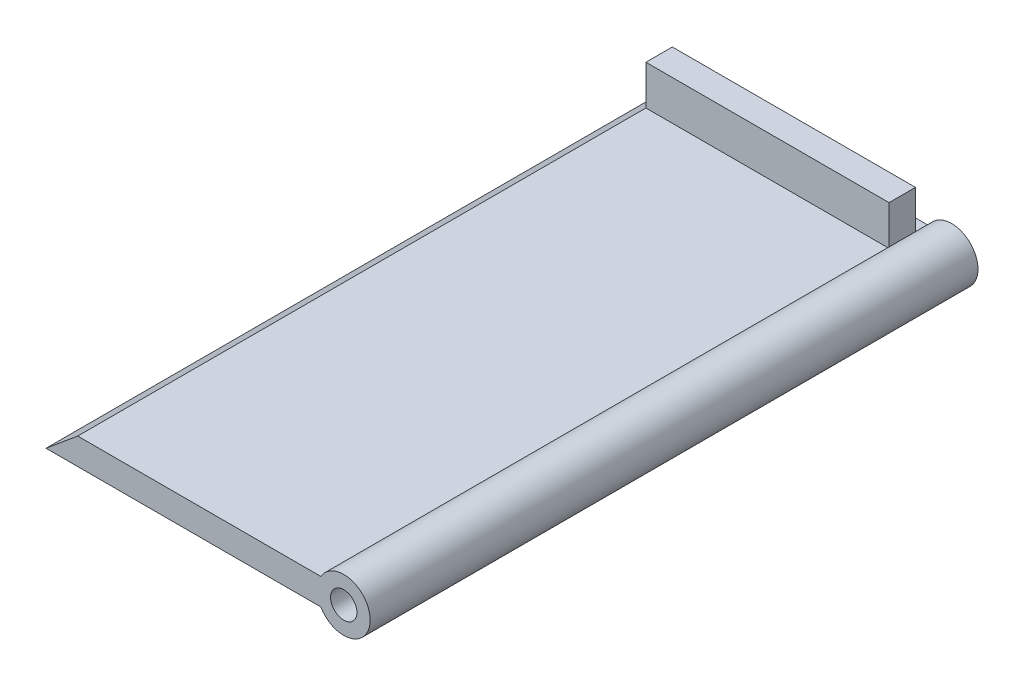
ISO-10303-21;
HEADER;
FILE_DESCRIPTION(('STEP AP214'),'2;1');
FILE_NAME('part.step','',(''),(''),'','','');
FILE_SCHEMA(('AUTOMOTIVE_DESIGN { 1 0 10303 214 1 1 1 1 }'));
ENDSEC;
DATA;
#1=APPLICATION_CONTEXT('core data for automotive mechanical design processes');
#2=APPLICATION_PROTOCOL_DEFINITION('international standard','automotive_design',2000,#1);
#3=PRODUCT_CONTEXT('',#1,'mechanical');
#4=PRODUCT('Part','Part','',(#3));
#5=PRODUCT_RELATED_PRODUCT_CATEGORY('part','',(#4));
#6=PRODUCT_DEFINITION_FORMATION('','',#4);
#7=PRODUCT_DEFINITION_CONTEXT('part definition',#1,'design');
#8=PRODUCT_DEFINITION('design','',#6,#7);
#9=PRODUCT_DEFINITION_SHAPE('','',#8);
#10=(LENGTH_UNIT() NAMED_UNIT(*) SI_UNIT(.MILLI.,.METRE.));
#11=(NAMED_UNIT(*) PLANE_ANGLE_UNIT() SI_UNIT($,.RADIAN.));
#12=(NAMED_UNIT(*) SI_UNIT($,.STERADIAN.) SOLID_ANGLE_UNIT());
#13=UNCERTAINTY_MEASURE_WITH_UNIT(LENGTH_MEASURE(1.E-05),#10,'distance_accuracy_value','');
#14=(GEOMETRIC_REPRESENTATION_CONTEXT(3) GLOBAL_UNCERTAINTY_ASSIGNED_CONTEXT((#13)) GLOBAL_UNIT_ASSIGNED_CONTEXT((#10,
#11,#12)) REPRESENTATION_CONTEXT('',''));
#15=CARTESIAN_POINT('',(0.,0.,0.));
#16=DIRECTION('',(0.,0.,1.));
#17=DIRECTION('',(1.,0.,0.));
#18=AXIS2_PLACEMENT_3D('',#15,#16,#17);
#19=CARTESIAN_POINT('',(32.7967450455694,2.81520392924816,146.05));
#20=DIRECTION('',(0.,-1.,0.));
#21=DIRECTION('',(1.,0.,0.));
#22=AXIS2_PLACEMENT_3D('',#19,#20,#21);
#23=PLANE('',#22);
#24=DIRECTION('',(-1.,0.,0.));
#25=VECTOR('',#24,1.);
#26=CARTESIAN_POINT('',(32.7967450455694,2.81520392924816,0.));
#27=LINE('',#26,#25);
#28=CARTESIAN_POINT('',(32.7967450455694,2.81520392924816,0.));
#29=VERTEX_POINT('',#28);
#30=CARTESIAN_POINT('',(-25.6232549544306,2.81520392924816,0.));
#31=VERTEX_POINT('',#30);
#32=EDGE_CURVE('E140',#29,#31,#27,.T.);
#33=ORIENTED_EDGE('',*,*,#32,.T.);
#34=DIRECTION('',(0.,0.,1.));
#35=VECTOR('',#34,1.);
#36=CARTESIAN_POINT('',(-25.6232549544306,2.81520392924816,0.));
#37=LINE('',#36,#35);
#38=CARTESIAN_POINT('',(-25.6232549544306,2.81520392924816,3.175));
#39=VERTEX_POINT('',#38);
#40=EDGE_CURVE('E123',#31,#39,#37,.T.);
#41=ORIENTED_EDGE('',*,*,#40,.T.);
#42=DIRECTION('',(1.,0.,0.));
#43=VECTOR('',#42,1.);
#44=CARTESIAN_POINT('',(-22.4482549544306,2.81520392924816,3.175));
#45=LINE('',#44,#43);
#46=CARTESIAN_POINT('',(-22.4482549544306,2.81520392924816,3.17500000000001));
#47=VERTEX_POINT('',#46);
#48=EDGE_CURVE('E200',#39,#47,#45,.T.);
#49=ORIENTED_EDGE('',*,*,#48,.T.);
#50=DIRECTION('',(0.,0.,-1.));
#51=VECTOR('',#50,1.);
#52=CARTESIAN_POINT('',(-22.4482549544306,2.81520392924816,6.35));
#53=LINE('',#52,#51);
#54=CARTESIAN_POINT('',(-22.4482549544306,2.81520392924816,6.34999999999999));
#55=VERTEX_POINT('',#54);
#56=EDGE_CURVE('E55',#55,#47,#53,.T.);
#57=ORIENTED_EDGE('',*,*,#56,.F.);
#58=DIRECTION('',(1.,0.,0.));
#59=VECTOR('',#58,1.);
#60=CARTESIAN_POINT('',(-25.6232549544306,2.81520392924816,6.35));
#61=LINE('',#60,#59);
#62=CARTESIAN_POINT('',(29.6217450455693,2.81520392924816,6.35));
#63=VERTEX_POINT('',#62);
#64=EDGE_CURVE('E217',#55,#63,#61,.T.);
#65=ORIENTED_EDGE('',*,*,#64,.T.);
#66=DIRECTION('',(0.,0.,-1.));
#67=VECTOR('',#66,1.);
#68=CARTESIAN_POINT('',(29.6217450455693,2.81520392924816,6.35));
#69=LINE('',#68,#67);
#70=CARTESIAN_POINT('',(29.6217450455693,2.81520392924816,3.175));
#71=VERTEX_POINT('',#70);
#72=EDGE_CURVE('E186',#63,#71,#69,.T.);
#73=ORIENTED_EDGE('',*,*,#72,.T.);
#74=DIRECTION('',(1.,0.,0.));
#75=VECTOR('',#74,1.);
#76=CARTESIAN_POINT('',(32.7967450455694,2.81520392924816,3.175));
#77=LINE('',#76,#75);
#78=CARTESIAN_POINT('',(32.7967450455694,2.81520392924816,3.17500000000001));
#79=VERTEX_POINT('',#78);
#80=EDGE_CURVE('E190',#71,#79,#77,.T.);
#81=ORIENTED_EDGE('',*,*,#80,.T.);
#82=DIRECTION('',(0.,0.,-1.));
#83=VECTOR('',#82,1.);
#84=CARTESIAN_POINT('',(32.7967450455694,2.81520392924816,146.05));
#85=LINE('',#84,#83);
#86=EDGE_CURVE('E41',#79,#29,#85,.T.);
#87=ORIENTED_EDGE('',*,*,#86,.T.);
#88=EDGE_LOOP('',(#33,#41,#49,#57,#65,#73,#81,#87));
#89=FACE_BOUND('',#88,.T.);
#90=ADVANCED_FACE('F33',(#89),#23,.F.);
#91=DIRECTION('',(1.,0.,0.));
#92=VECTOR('',#91,1.);
#93=CARTESIAN_POINT('',(-25.6232549544306,2.81520392924816,9.525));
#94=LINE('',#93,#92);
#95=CARTESIAN_POINT('',(-25.6232549544306,2.81520392924816,9.52500000000001));
#96=VERTEX_POINT('',#95);
#97=CARTESIAN_POINT('',(32.7967450455694,2.81520392924816,9.52500000000001));
#98=VERTEX_POINT('',#97);
#99=EDGE_CURVE('E225',#96,#98,#94,.T.);
#100=ORIENTED_EDGE('',*,*,#99,.F.);
#101=CARTESIAN_POINT('',(-25.6232549544306,2.81520392924816,146.05));
#102=VERTEX_POINT('',#101);
#103=EDGE_CURVE('E133',#96,#102,#37,.T.);
#104=ORIENTED_EDGE('',*,*,#103,.T.);
#105=DIRECTION('',(-1.,0.,0.));
#106=VECTOR('',#105,1.);
#107=CARTESIAN_POINT('',(32.7967450455694,2.81520392924816,146.05));
#108=LINE('',#107,#106);
#109=CARTESIAN_POINT('',(32.7967450455694,2.81520392924816,146.05));
#110=VERTEX_POINT('',#109);
#111=EDGE_CURVE('E158',#110,#102,#108,.T.);
#112=ORIENTED_EDGE('',*,*,#111,.F.);
#113=EDGE_CURVE('E11',#110,#98,#85,.T.);
#114=ORIENTED_EDGE('',*,*,#113,.T.);
#115=EDGE_LOOP('',(#100,#104,#112,#114));
#116=FACE_BOUND('',#115,.T.);
#117=ADVANCED_FACE('F234',(#116),#23,.F.);
#118=CARTESIAN_POINT('',(38.2960063596005,-0.359796070751835,146.05));
#119=DIRECTION('',(0.,0.,1.));
#120=DIRECTION('',(1.,0.,0.));
#121=AXIS2_PLACEMENT_3D('',#118,#119,#120);
#122=PLANE('',#121);
#123=DIRECTION('',(0.768221279597376,0.64018439966448,0.));
#124=VECTOR('',#123,1.);
#125=CARTESIAN_POINT('',(-33.2432549544307,-3.53479607075184,146.05));
#126=LINE('',#125,#124);
#127=CARTESIAN_POINT('',(-33.2432549544307,-3.53479607075184,146.05));
#128=VERTEX_POINT('',#127);
#129=EDGE_CURVE('E144',#128,#102,#126,.T.);
#130=ORIENTED_EDGE('',*,*,#129,.F.);
#131=DIRECTION('',(1.,0.,0.));
#132=VECTOR('',#131,1.);
#133=CARTESIAN_POINT('',(32.7967450455694,-3.53479607075183,146.05));
#134=LINE('',#133,#132);
#135=CARTESIAN_POINT('',(32.7967450455694,-3.53479607075183,146.05));
#136=VERTEX_POINT('',#135);
#137=EDGE_CURVE('E155',#128,#136,#134,.T.);
#138=ORIENTED_EDGE('',*,*,#137,.T.);
#139=CARTESIAN_POINT('',(38.2960063596005,-0.359796070751835,146.05));
#140=DIRECTION('',(0.,0.,1.));
#141=DIRECTION('',(1.,0.,0.));
#142=AXIS2_PLACEMENT_3D('',#139,#140,#141);
#143=CIRCLE('',#142,6.35);
#144=EDGE_CURVE('E148',#136,#110,#143,.T.);
#145=ORIENTED_EDGE('',*,*,#144,.T.);
#146=ORIENTED_EDGE('',*,*,#111,.T.);
#147=EDGE_LOOP('',(#130,#138,#145,#146));
#148=FACE_BOUND('',#147,.T.);
#149=CARTESIAN_POINT('',(38.2960063596005,-0.359796070751835,146.05));
#150=DIRECTION('',(0.,0.,1.));
#151=DIRECTION('',(1.,0.,0.));
#152=AXIS2_PLACEMENT_3D('',#149,#150,#151);
#153=CIRCLE('',#152,3.175);
#154=CARTESIAN_POINT('',(41.4710063596005,-0.359796070751835,146.05));
#155=VERTEX_POINT('',#154);
#156=EDGE_CURVE('E150',#155,#155,#153,.T.);
#157=ORIENTED_EDGE('',*,*,#156,.F.);
#158=EDGE_LOOP('',(#157));
#159=FACE_BOUND('',#158,.T.);
#160=ADVANCED_FACE('F235',(#148,#159),#122,.T.);
#161=CARTESIAN_POINT('',(38.2960063596005,-0.359796070751835,0.));
#162=DIRECTION('',(0.,0.,1.));
#163=DIRECTION('',(1.,0.,0.));
#164=AXIS2_PLACEMENT_3D('',#161,#162,#163);
#165=PLANE('',#164);
#166=DIRECTION('',(1.,0.,0.));
#167=VECTOR('',#166,1.);
#168=CARTESIAN_POINT('',(32.7967450455694,-3.53479607075183,0.));
#169=LINE('',#168,#167);
#170=CARTESIAN_POINT('',(-33.2432549544307,-3.53479607075184,0.));
#171=VERTEX_POINT('',#170);
#172=CARTESIAN_POINT('',(32.7967450455694,-3.53479607075183,0.));
#173=VERTEX_POINT('',#172);
#174=EDGE_CURVE('E142',#171,#173,#169,.T.);
#175=ORIENTED_EDGE('',*,*,#174,.F.);
#176=DIRECTION('',(0.768221279597376,0.64018439966448,0.));
#177=VECTOR('',#176,1.);
#178=CARTESIAN_POINT('',(-33.2432549544307,-3.53479607075184,0.));
#179=LINE('',#178,#177);
#180=EDGE_CURVE('E126',#171,#31,#179,.T.);
#181=ORIENTED_EDGE('',*,*,#180,.T.);
#182=ORIENTED_EDGE('',*,*,#32,.F.);
#183=CARTESIAN_POINT('',(38.2960063596005,-0.359796070751835,0.));
#184=DIRECTION('',(0.,0.,1.));
#185=DIRECTION('',(1.,0.,0.));
#186=AXIS2_PLACEMENT_3D('',#183,#184,#185);
#187=CIRCLE('',#186,6.35);
#188=EDGE_CURVE('E146',#173,#29,#187,.T.);
#189=ORIENTED_EDGE('',*,*,#188,.F.);
#190=EDGE_LOOP('',(#175,#181,#182,#189));
#191=FACE_BOUND('',#190,.T.);
#192=CARTESIAN_POINT('',(38.2960063596005,-0.359796070751835,0.));
#193=DIRECTION('',(0.,0.,1.));
#194=DIRECTION('',(1.,0.,0.));
#195=AXIS2_PLACEMENT_3D('',#192,#193,#194);
#196=CIRCLE('',#195,3.175);
#197=CARTESIAN_POINT('',(41.4710063596005,-0.359796070751835,0.));
#198=VERTEX_POINT('',#197);
#199=EDGE_CURVE('E167',#198,#198,#196,.T.);
#200=ORIENTED_EDGE('',*,*,#199,.T.);
#201=EDGE_LOOP('',(#200));
#202=FACE_BOUND('',#201,.T.);
#203=ADVANCED_FACE('F137',(#191,#202),#165,.F.);
#204=CARTESIAN_POINT('',(38.2960063596005,-0.359796070751835,146.05));
#205=DIRECTION('',(0.,0.,-1.));
#206=DIRECTION('',(-1.,0.,0.));
#207=AXIS2_PLACEMENT_3D('',#204,#205,#206);
#208=CYLINDRICAL_SURFACE('',#207,6.35);
#209=ORIENTED_EDGE('',*,*,#188,.T.);
#210=ORIENTED_EDGE('',*,*,#86,.F.);
#211=DIRECTION('',(0.,0.,-1.));
#212=VECTOR('',#211,1.);
#213=CARTESIAN_POINT('',(32.7967450455694,2.81520392924816,6.35));
#214=LINE('',#213,#212);
#215=EDGE_CURVE('E48',#98,#79,#214,.T.);
#216=ORIENTED_EDGE('',*,*,#215,.F.);
#217=ORIENTED_EDGE('',*,*,#113,.F.);
#218=ORIENTED_EDGE('',*,*,#144,.F.);
#219=DIRECTION('',(0.,0.,-1.));
#220=VECTOR('',#219,1.);
#221=CARTESIAN_POINT('',(32.7967450455694,-3.53479607075183,146.05));
#222=LINE('',#221,#220);
#223=EDGE_CURVE('E153',#136,#173,#222,.T.);
#224=ORIENTED_EDGE('',*,*,#223,.T.);
#225=EDGE_LOOP('',(#209,#210,#216,#217,#218,#224));
#226=FACE_BOUND('',#225,.T.);
#227=ADVANCED_FACE('F35',(#226),#208,.T.);
#228=CARTESIAN_POINT('',(32.7967450455694,-3.53479607075183,146.05));
#229=DIRECTION('',(0.,1.,0.));
#230=DIRECTION('',(-1.,0.,0.));
#231=AXIS2_PLACEMENT_3D('',#228,#229,#230);
#232=PLANE('',#231);
#233=ORIENTED_EDGE('',*,*,#174,.T.);
#234=ORIENTED_EDGE('',*,*,#223,.F.);
#235=ORIENTED_EDGE('',*,*,#137,.F.);
#236=DIRECTION('',(0.,0.,1.));
#237=VECTOR('',#236,1.);
#238=CARTESIAN_POINT('',(-33.2432549544307,-3.53479607075184,0.));
#239=LINE('',#238,#237);
#240=EDGE_CURVE('E132',#171,#128,#239,.T.);
#241=ORIENTED_EDGE('',*,*,#240,.F.);
#242=EDGE_LOOP('',(#233,#234,#235,#241));
#243=FACE_BOUND('',#242,.T.);
#244=ADVANCED_FACE('F281',(#243),#232,.F.);
#245=CARTESIAN_POINT('',(38.2960063596005,-0.359796070751835,146.05));
#246=DIRECTION('',(0.,0.,-1.));
#247=DIRECTION('',(-1.,0.,0.));
#248=AXIS2_PLACEMENT_3D('',#245,#246,#247);
#249=CYLINDRICAL_SURFACE('',#248,3.175);
#250=ORIENTED_EDGE('',*,*,#156,.T.);
#251=EDGE_LOOP('',(#250));
#252=FACE_BOUND('',#251,.T.);
#253=ORIENTED_EDGE('',*,*,#199,.F.);
#254=EDGE_LOOP('',(#253));
#255=FACE_BOUND('',#254,.T.);
#256=ADVANCED_FACE('F284',(#252,#255),#249,.F.);
#257=CARTESIAN_POINT('',(32.7967450455694,2.81520392924816,6.35));
#258=DIRECTION('',(-1.,0.,0.));
#259=DIRECTION('',(0.,0.,1.));
#260=AXIS2_PLACEMENT_3D('',#257,#258,#259);
#261=PLANE('',#260);
#262=DIRECTION('',(0.,1.,0.));
#263=VECTOR('',#262,1.);
#264=CARTESIAN_POINT('',(32.7967450455694,2.81520392924816,3.175));
#265=LINE('',#264,#263);
#266=CARTESIAN_POINT('',(32.7967450455694,12.3402039292482,3.175));
#267=VERTEX_POINT('',#266);
#268=EDGE_CURVE('E206',#79,#267,#265,.T.);
#269=ORIENTED_EDGE('',*,*,#268,.T.);
#270=DIRECTION('',(0.,0.,-1.));
#271=VECTOR('',#270,1.);
#272=CARTESIAN_POINT('',(32.7967450455694,12.3402039292482,6.35));
#273=LINE('',#272,#271);
#274=CARTESIAN_POINT('',(32.7967450455694,12.3402039292482,9.525));
#275=VERTEX_POINT('',#274);
#276=EDGE_CURVE('E170',#275,#267,#273,.T.);
#277=ORIENTED_EDGE('',*,*,#276,.F.);
#278=DIRECTION('',(0.,1.,0.));
#279=VECTOR('',#278,1.);
#280=CARTESIAN_POINT('',(32.7967450455694,12.3402039292482,9.525));
#281=LINE('',#280,#279);
#282=EDGE_CURVE('E222',#98,#275,#281,.T.);
#283=ORIENTED_EDGE('',*,*,#282,.F.);
#284=ORIENTED_EDGE('',*,*,#215,.T.);
#285=EDGE_LOOP('',(#269,#277,#283,#284));
#286=FACE_BOUND('',#285,.T.);
#287=ADVANCED_FACE('F243',(#286),#261,.F.);
#288=CARTESIAN_POINT('',(32.7967450455694,12.3402039292482,6.35));
#289=DIRECTION('',(0.,-1.,0.));
#290=DIRECTION('',(1.,0.,0.));
#291=AXIS2_PLACEMENT_3D('',#288,#289,#290);
#292=PLANE('',#291);
#293=DIRECTION('',(-1.,0.,0.));
#294=VECTOR('',#293,1.);
#295=CARTESIAN_POINT('',(32.7967450455694,12.3402039292482,3.175));
#296=LINE('',#295,#294);
#297=CARTESIAN_POINT('',(-25.6232549544306,12.3402039292482,3.175));
#298=VERTEX_POINT('',#297);
#299=EDGE_CURVE('E204',#267,#298,#296,.T.);
#300=ORIENTED_EDGE('',*,*,#299,.T.);
#301=DIRECTION('',(0.,0.,-1.));
#302=VECTOR('',#301,1.);
#303=CARTESIAN_POINT('',(-25.6232549544306,12.3402039292482,6.35));
#304=LINE('',#303,#302);
#305=CARTESIAN_POINT('',(-25.6232549544306,12.3402039292482,9.525));
#306=VERTEX_POINT('',#305);
#307=EDGE_CURVE('E175',#306,#298,#304,.T.);
#308=ORIENTED_EDGE('',*,*,#307,.F.);
#309=DIRECTION('',(-1.,0.,0.));
#310=VECTOR('',#309,1.);
#311=CARTESIAN_POINT('',(-25.6232549544306,12.3402039292482,9.525));
#312=LINE('',#311,#310);
#313=EDGE_CURVE('E209',#275,#306,#312,.T.);
#314=ORIENTED_EDGE('',*,*,#313,.F.);
#315=ORIENTED_EDGE('',*,*,#276,.T.);
#316=EDGE_LOOP('',(#300,#308,#314,#315));
#317=FACE_BOUND('',#316,.T.);
#318=ADVANCED_FACE('F246',(#317),#292,.F.);
#319=CARTESIAN_POINT('',(-25.6232549544306,2.81520392924816,6.35));
#320=DIRECTION('',(1.,0.,0.));
#321=DIRECTION('',(0.,0.,-1.));
#322=AXIS2_PLACEMENT_3D('',#319,#320,#321);
#323=PLANE('',#322);
#324=DIRECTION('',(0.,-1.,0.));
#325=VECTOR('',#324,1.);
#326=CARTESIAN_POINT('',(-25.6232549544306,2.81520392924816,3.175));
#327=LINE('',#326,#325);
#328=EDGE_CURVE('E202',#298,#39,#327,.T.);
#329=ORIENTED_EDGE('',*,*,#328,.T.);
#330=DIRECTION('',(0.,0.,-1.));
#331=VECTOR('',#330,1.);
#332=CARTESIAN_POINT('',(-25.6232549544306,2.81520392924816,6.35));
#333=LINE('',#332,#331);
#334=EDGE_CURVE('E129',#96,#39,#333,.T.);
#335=ORIENTED_EDGE('',*,*,#334,.F.);
#336=DIRECTION('',(0.,-1.,0.));
#337=VECTOR('',#336,1.);
#338=CARTESIAN_POINT('',(-25.6232549544306,12.3402039292482,9.525));
#339=LINE('',#338,#337);
#340=EDGE_CURVE('E219',#306,#96,#339,.T.);
#341=ORIENTED_EDGE('',*,*,#340,.F.);
#342=ORIENTED_EDGE('',*,*,#307,.T.);
#343=EDGE_LOOP('',(#329,#335,#341,#342));
#344=FACE_BOUND('',#343,.T.);
#345=ADVANCED_FACE('F248',(#344),#323,.F.);
#346=CARTESIAN_POINT('',(-22.4482549544306,2.81520392924816,6.35));
#347=DIRECTION('',(-1.,0.,0.));
#348=DIRECTION('',(0.,0.,1.));
#349=AXIS2_PLACEMENT_3D('',#346,#347,#348);
#350=PLANE('',#349);
#351=DIRECTION('',(0.,1.,0.));
#352=VECTOR('',#351,1.);
#353=CARTESIAN_POINT('',(-22.4482549544306,2.81520392924816,3.175));
#354=LINE('',#353,#352);
#355=CARTESIAN_POINT('',(-22.4482549544306,9.16520392924816,3.175));
#356=VERTEX_POINT('',#355);
#357=EDGE_CURVE('E198',#47,#356,#354,.T.);
#358=ORIENTED_EDGE('',*,*,#357,.T.);
#359=DIRECTION('',(0.,0.,-1.));
#360=VECTOR('',#359,1.);
#361=CARTESIAN_POINT('',(-22.4482549544306,9.16520392924816,6.35));
#362=LINE('',#361,#360);
#363=CARTESIAN_POINT('',(-22.4482549544306,9.16520392924816,6.35));
#364=VERTEX_POINT('',#363);
#365=EDGE_CURVE('E180',#364,#356,#362,.T.);
#366=ORIENTED_EDGE('',*,*,#365,.F.);
#367=DIRECTION('',(0.,1.,0.));
#368=VECTOR('',#367,1.);
#369=CARTESIAN_POINT('',(-22.4482549544306,2.81520392924816,6.35));
#370=LINE('',#369,#368);
#371=EDGE_CURVE('E192',#55,#364,#370,.T.);
#372=ORIENTED_EDGE('',*,*,#371,.F.);
#373=ORIENTED_EDGE('',*,*,#56,.T.);
#374=EDGE_LOOP('',(#358,#366,#372,#373));
#375=FACE_BOUND('',#374,.T.);
#376=ADVANCED_FACE('F256',(#375),#350,.F.);
#377=CARTESIAN_POINT('',(29.6217450455693,9.16520392924816,6.35));
#378=DIRECTION('',(0.,1.,0.));
#379=DIRECTION('',(-1.,0.,0.));
#380=AXIS2_PLACEMENT_3D('',#377,#378,#379);
#381=PLANE('',#380);
#382=DIRECTION('',(1.,0.,0.));
#383=VECTOR('',#382,1.);
#384=CARTESIAN_POINT('',(29.6217450455693,9.16520392924816,3.175));
#385=LINE('',#384,#383);
#386=CARTESIAN_POINT('',(29.6217450455693,9.16520392924816,3.175));
#387=VERTEX_POINT('',#386);
#388=EDGE_CURVE('E196',#356,#387,#385,.T.);
#389=ORIENTED_EDGE('',*,*,#388,.T.);
#390=DIRECTION('',(0.,0.,-1.));
#391=VECTOR('',#390,1.);
#392=CARTESIAN_POINT('',(29.6217450455693,9.16520392924816,6.35));
#393=LINE('',#392,#391);
#394=CARTESIAN_POINT('',(29.6217450455693,9.16520392924816,6.35));
#395=VERTEX_POINT('',#394);
#396=EDGE_CURVE('E183',#395,#387,#393,.T.);
#397=ORIENTED_EDGE('',*,*,#396,.F.);
#398=DIRECTION('',(1.,0.,0.));
#399=VECTOR('',#398,1.);
#400=CARTESIAN_POINT('',(29.6217450455693,9.16520392924816,6.35));
#401=LINE('',#400,#399);
#402=EDGE_CURVE('E212',#364,#395,#401,.T.);
#403=ORIENTED_EDGE('',*,*,#402,.F.);
#404=ORIENTED_EDGE('',*,*,#365,.T.);
#405=EDGE_LOOP('',(#389,#397,#403,#404));
#406=FACE_BOUND('',#405,.T.);
#407=ADVANCED_FACE('F267',(#406),#381,.F.);
#408=CARTESIAN_POINT('',(29.6217450455693,2.81520392924816,6.35));
#409=DIRECTION('',(1.,0.,0.));
#410=DIRECTION('',(0.,0.,-1.));
#411=AXIS2_PLACEMENT_3D('',#408,#409,#410);
#412=PLANE('',#411);
#413=DIRECTION('',(0.,-1.,0.));
#414=VECTOR('',#413,1.);
#415=CARTESIAN_POINT('',(29.6217450455693,2.81520392924816,3.175));
#416=LINE('',#415,#414);
#417=EDGE_CURVE('E193',#387,#71,#416,.T.);
#418=ORIENTED_EDGE('',*,*,#417,.T.);
#419=ORIENTED_EDGE('',*,*,#72,.F.);
#420=DIRECTION('',(0.,-1.,0.));
#421=VECTOR('',#420,1.);
#422=CARTESIAN_POINT('',(29.6217450455693,2.81520392924816,6.35));
#423=LINE('',#422,#421);
#424=EDGE_CURVE('E189',#395,#63,#423,.T.);
#425=ORIENTED_EDGE('',*,*,#424,.F.);
#426=ORIENTED_EDGE('',*,*,#396,.T.);
#427=EDGE_LOOP('',(#418,#419,#425,#426));
#428=FACE_BOUND('',#427,.T.);
#429=ADVANCED_FACE('F265',(#428),#412,.F.);
#430=CARTESIAN_POINT('',(0.,0.,3.175));
#431=DIRECTION('',(0.,0.,1.));
#432=DIRECTION('',(1.,0.,0.));
#433=AXIS2_PLACEMENT_3D('',#430,#431,#432);
#434=PLANE('',#433);
#435=ORIENTED_EDGE('',*,*,#268,.F.);
#436=ORIENTED_EDGE('',*,*,#80,.F.);
#437=ORIENTED_EDGE('',*,*,#417,.F.);
#438=ORIENTED_EDGE('',*,*,#388,.F.);
#439=ORIENTED_EDGE('',*,*,#357,.F.);
#440=ORIENTED_EDGE('',*,*,#48,.F.);
#441=ORIENTED_EDGE('',*,*,#328,.F.);
#442=ORIENTED_EDGE('',*,*,#299,.F.);
#443=EDGE_LOOP('',(#435,#436,#437,#438,#439,#440,#441,#442));
#444=FACE_BOUND('',#443,.T.);
#445=ADVANCED_FACE('F253',(#444),#434,.F.);
#446=CARTESIAN_POINT('',(0.,0.,9.525));
#447=DIRECTION('',(0.,0.,1.));
#448=DIRECTION('',(1.,0.,0.));
#449=AXIS2_PLACEMENT_3D('',#446,#447,#448);
#450=PLANE('',#449);
#451=ORIENTED_EDGE('',*,*,#340,.T.);
#452=ORIENTED_EDGE('',*,*,#99,.T.);
#453=ORIENTED_EDGE('',*,*,#282,.T.);
#454=ORIENTED_EDGE('',*,*,#313,.T.);
#455=EDGE_LOOP('',(#451,#452,#453,#454));
#456=FACE_BOUND('',#455,.T.);
#457=ADVANCED_FACE('F239',(#456),#450,.T.);
#458=CARTESIAN_POINT('',(0.,0.,6.35));
#459=DIRECTION('',(0.,0.,1.));
#460=DIRECTION('',(1.,0.,0.));
#461=AXIS2_PLACEMENT_3D('',#458,#459,#460);
#462=PLANE('',#461);
#463=ORIENTED_EDGE('',*,*,#64,.F.);
#464=ORIENTED_EDGE('',*,*,#371,.T.);
#465=ORIENTED_EDGE('',*,*,#402,.T.);
#466=ORIENTED_EDGE('',*,*,#424,.T.);
#467=EDGE_LOOP('',(#463,#464,#465,#466));
#468=FACE_BOUND('',#467,.T.);
#469=ADVANCED_FACE('F260',(#468),#462,.F.);
#470=CARTESIAN_POINT('',(-33.2432549544307,-3.53479607075184,0.));
#471=DIRECTION('',(0.64018439966448,-0.768221279597376,0.));
#472=DIRECTION('',(0.768221279597376,0.64018439966448,0.));
#473=AXIS2_PLACEMENT_3D('',#470,#471,#472);
#474=PLANE('',#473);
#475=ORIENTED_EDGE('',*,*,#129,.T.);
#476=ORIENTED_EDGE('',*,*,#103,.F.);
#477=ORIENTED_EDGE('',*,*,#334,.T.);
#478=ORIENTED_EDGE('',*,*,#40,.F.);
#479=ORIENTED_EDGE('',*,*,#180,.F.);
#480=ORIENTED_EDGE('',*,*,#240,.T.);
#481=EDGE_LOOP('',(#475,#476,#477,#478,#479,#480));
#482=FACE_BOUND('',#481,.T.);
#483=ADVANCED_FACE('F125',(#482),#474,.F.);
#484=CLOSED_SHELL('',(#90,#117,#160,#203,#227,#244,#256,#287,#318,#345,#376,#407,#429,#445,#457,
#469,#483));
#485=MANIFOLD_SOLID_BREP('B2',#484);
#486=ADVANCED_BREP_SHAPE_REPRESENTATION('',(#18,#485),#14);
#487=SHAPE_DEFINITION_REPRESENTATION(#9,#486);
ENDSEC;
END-ISO-10303-21;
